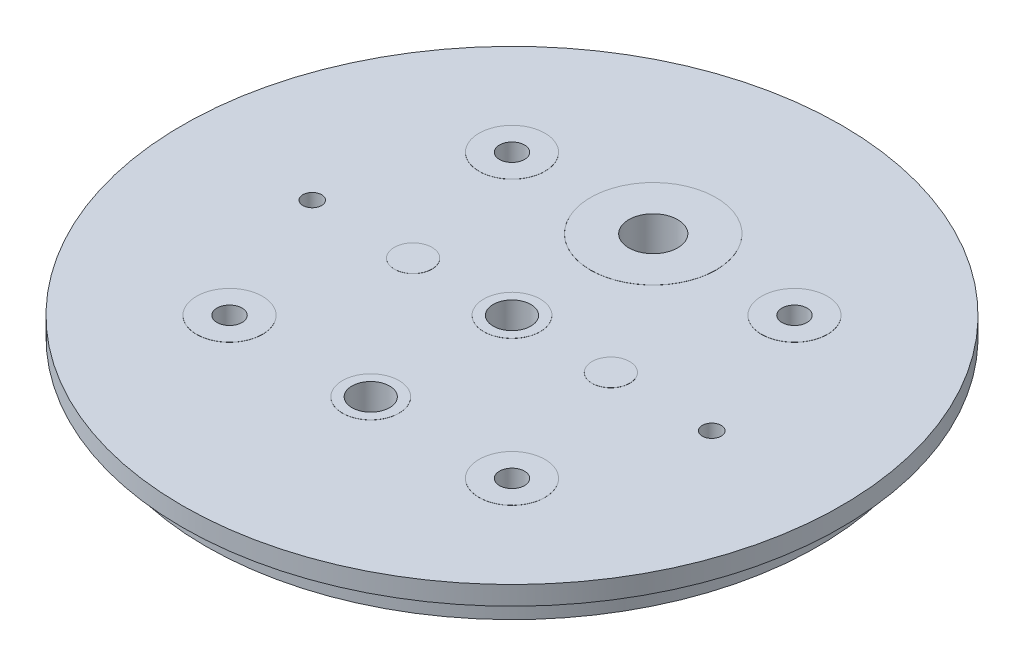
ISO-10303-21;
HEADER;
FILE_DESCRIPTION(('STEP AP214'),'2;1');
FILE_NAME('part.step','',(''),(''),'','','');
FILE_SCHEMA(('AUTOMOTIVE_DESIGN { 1 0 10303 214 1 1 1 1 }'));
ENDSEC;
DATA;
#1=APPLICATION_CONTEXT('core data for automotive mechanical design processes');
#2=APPLICATION_PROTOCOL_DEFINITION('international standard','automotive_design',2000,#1);
#3=PRODUCT_CONTEXT('',#1,'mechanical');
#4=PRODUCT('Part','Part','',(#3));
#5=PRODUCT_RELATED_PRODUCT_CATEGORY('part','',(#4));
#6=PRODUCT_DEFINITION_FORMATION('','',#4);
#7=PRODUCT_DEFINITION_CONTEXT('part definition',#1,'design');
#8=PRODUCT_DEFINITION('design','',#6,#7);
#9=PRODUCT_DEFINITION_SHAPE('','',#8);
#10=(LENGTH_UNIT() NAMED_UNIT(*) SI_UNIT(.MILLI.,.METRE.));
#11=(NAMED_UNIT(*) PLANE_ANGLE_UNIT() SI_UNIT($,.RADIAN.));
#12=(NAMED_UNIT(*) SI_UNIT($,.STERADIAN.) SOLID_ANGLE_UNIT());
#13=UNCERTAINTY_MEASURE_WITH_UNIT(LENGTH_MEASURE(1.E-05),#10,'distance_accuracy_value','');
#14=(GEOMETRIC_REPRESENTATION_CONTEXT(3) GLOBAL_UNCERTAINTY_ASSIGNED_CONTEXT((#13)) GLOBAL_UNIT_ASSIGNED_CONTEXT((#10,
#11,#12)) REPRESENTATION_CONTEXT('',''));
#15=CARTESIAN_POINT('',(0.,0.,0.));
#16=DIRECTION('',(0.,0.,1.));
#17=DIRECTION('',(1.,0.,0.));
#18=AXIS2_PLACEMENT_3D('',#15,#16,#17);
#19=CARTESIAN_POINT('',(22.4996823848627,36.2233266135934,22.3432986914773));
#20=DIRECTION('',(0.,-1.,0.));
#21=DIRECTION('',(0.,0.,-1.));
#22=AXIS2_PLACEMENT_3D('',#19,#20,#21);
#23=CYLINDRICAL_SURFACE('',#22,2.);
#24=CARTESIAN_POINT('',(22.4996823848627,26.2423537848137,22.3432986914773));
#25=DIRECTION('',(0.,-1.,0.));
#26=DIRECTION('',(1.,0.,0.));
#27=AXIS2_PLACEMENT_3D('',#24,#25,#26);
#28=CIRCLE('',#27,2.);
#29=CARTESIAN_POINT('',(24.4996823848627,26.2423537848137,22.3432986914773));
#30=VERTEX_POINT('',#29);
#31=EDGE_CURVE('E138',#30,#30,#28,.F.);
#32=ORIENTED_EDGE('',*,*,#31,.T.);
#33=EDGE_LOOP('',(#32));
#34=FACE_BOUND('',#33,.T.);
#35=CARTESIAN_POINT('',(22.4996823848627,20.7233240058903,22.3432986914773));
#36=DIRECTION('',(0.,-1.,0.));
#37=DIRECTION('',(1.,0.,0.));
#38=AXIS2_PLACEMENT_3D('',#35,#36,#37);
#39=CIRCLE('',#38,2.);
#40=CARTESIAN_POINT('',(24.4996823848627,20.7233240058903,22.3432986914773));
#41=VERTEX_POINT('',#40);
#42=EDGE_CURVE('E49',#41,#41,#39,.T.);
#43=ORIENTED_EDGE('',*,*,#42,.T.);
#44=EDGE_LOOP('',(#43));
#45=FACE_BOUND('',#44,.T.);
#46=ADVANCED_FACE('F45',(#34,#45),#23,.F.);
#47=CARTESIAN_POINT('',(-22.5003182856895,36.2233266135934,22.3432986914773));
#48=DIRECTION('',(0.,-1.,0.));
#49=DIRECTION('',(0.,0.,-1.));
#50=AXIS2_PLACEMENT_3D('',#47,#48,#49);
#51=CYLINDRICAL_SURFACE('',#50,2.);
#52=CARTESIAN_POINT('',(-22.5003182856895,26.2423537848136,22.3432986914773));
#53=DIRECTION('',(0.,-1.,0.));
#54=DIRECTION('',(1.,0.,0.));
#55=AXIS2_PLACEMENT_3D('',#52,#53,#54);
#56=CIRCLE('',#55,2.);
#57=CARTESIAN_POINT('',(-20.5003182856895,26.2423537848136,22.3432986914773));
#58=VERTEX_POINT('',#57);
#59=EDGE_CURVE('E145',#58,#58,#56,.F.);
#60=ORIENTED_EDGE('',*,*,#59,.T.);
#61=EDGE_LOOP('',(#60));
#62=FACE_BOUND('',#61,.T.);
#63=CARTESIAN_POINT('',(-22.5003182856895,20.7233240058903,22.3432986914773));
#64=DIRECTION('',(0.,-1.,0.));
#65=DIRECTION('',(1.,0.,0.));
#66=AXIS2_PLACEMENT_3D('',#63,#64,#65);
#67=CIRCLE('',#66,2.);
#68=CARTESIAN_POINT('',(-20.5003182856895,20.7233240058903,22.3432986914773));
#69=VERTEX_POINT('',#68);
#70=EDGE_CURVE('E168',#69,#69,#67,.T.);
#71=ORIENTED_EDGE('',*,*,#70,.T.);
#72=EDGE_LOOP('',(#71));
#73=FACE_BOUND('',#72,.T.);
#74=ADVANCED_FACE('F280',(#62,#73),#51,.F.);
#75=CARTESIAN_POINT('',(-22.5003182856895,36.2233266135934,-22.6567019790749));
#76=DIRECTION('',(0.,-1.,0.));
#77=DIRECTION('',(0.,0.,-1.));
#78=AXIS2_PLACEMENT_3D('',#75,#76,#77);
#79=CYLINDRICAL_SURFACE('',#78,2.);
#80=CARTESIAN_POINT('',(-22.5003182856895,26.2423537848136,-22.6567019790749));
#81=DIRECTION('',(0.,-1.,0.));
#82=DIRECTION('',(1.,0.,0.));
#83=AXIS2_PLACEMENT_3D('',#80,#81,#82);
#84=CIRCLE('',#83,2.);
#85=CARTESIAN_POINT('',(-20.5003182856895,26.2423537848136,-22.6567019790749));
#86=VERTEX_POINT('',#85);
#87=EDGE_CURVE('E148',#86,#86,#84,.F.);
#88=ORIENTED_EDGE('',*,*,#87,.T.);
#89=EDGE_LOOP('',(#88));
#90=FACE_BOUND('',#89,.T.);
#91=CARTESIAN_POINT('',(-22.5003182856895,20.7233240058903,-22.6567019790749));
#92=DIRECTION('',(0.,-1.,0.));
#93=DIRECTION('',(1.,0.,0.));
#94=AXIS2_PLACEMENT_3D('',#91,#92,#93);
#95=CIRCLE('',#94,2.);
#96=CARTESIAN_POINT('',(-20.5003182856895,20.7233240058903,-22.6567019790749));
#97=VERTEX_POINT('',#96);
#98=EDGE_CURVE('E165',#97,#97,#95,.T.);
#99=ORIENTED_EDGE('',*,*,#98,.T.);
#100=EDGE_LOOP('',(#99));
#101=FACE_BOUND('',#100,.T.);
#102=ADVANCED_FACE('F287',(#90,#101),#79,.F.);
#103=CARTESIAN_POINT('',(22.4996823848627,36.2233266135934,-22.6567019790749));
#104=DIRECTION('',(0.,-1.,0.));
#105=DIRECTION('',(0.,0.,-1.));
#106=AXIS2_PLACEMENT_3D('',#103,#104,#105);
#107=CYLINDRICAL_SURFACE('',#106,2.);
#108=CARTESIAN_POINT('',(22.4996823848627,26.2423537848137,-22.6567019790749));
#109=DIRECTION('',(0.,-1.,0.));
#110=DIRECTION('',(1.,0.,0.));
#111=AXIS2_PLACEMENT_3D('',#108,#109,#110);
#112=CIRCLE('',#111,2.);
#113=CARTESIAN_POINT('',(24.4996823848627,26.2423537848137,-22.6567019790749));
#114=VERTEX_POINT('',#113);
#115=EDGE_CURVE('E151',#114,#114,#112,.F.);
#116=ORIENTED_EDGE('',*,*,#115,.T.);
#117=EDGE_LOOP('',(#116));
#118=FACE_BOUND('',#117,.T.);
#119=CARTESIAN_POINT('',(22.4996823848627,20.7233240058903,-22.6567019790749));
#120=DIRECTION('',(0.,-1.,0.));
#121=DIRECTION('',(1.,0.,0.));
#122=AXIS2_PLACEMENT_3D('',#119,#120,#121);
#123=CIRCLE('',#122,2.);
#124=CARTESIAN_POINT('',(24.4996823848627,20.7233240058903,-22.6567019790749));
#125=VERTEX_POINT('',#124);
#126=EDGE_CURVE('E162',#125,#125,#123,.T.);
#127=ORIENTED_EDGE('',*,*,#126,.T.);
#128=EDGE_LOOP('',(#127));
#129=FACE_BOUND('',#128,.T.);
#130=ADVANCED_FACE('F458',(#118,#129),#107,.F.);
#131=CARTESIAN_POINT('',(-0.000317950413387203,26.2233266135934,52.3432991385121));
#132=DIRECTION('',(0.,1.,0.));
#133=DIRECTION('',(1.,0.,0.));
#134=AXIS2_PLACEMENT_3D('',#131,#132,#133);
#135=PLANE('',#134);
#136=CARTESIAN_POINT('',(-31.82012357796,26.2233266135934,-0.15670164379878));
#137=DIRECTION('',(0.,1.,0.));
#138=DIRECTION('',(0.,0.,1.));
#139=AXIS2_PLACEMENT_3D('',#136,#137,#138);
#140=CIRCLE('',#139,1.5);
#141=CARTESIAN_POINT('',(-31.82012357796,26.2233266135934,1.34329835620122));
#142=VERTEX_POINT('',#141);
#143=EDGE_CURVE('E161',#142,#142,#140,.F.);
#144=ORIENTED_EDGE('',*,*,#143,.T.);
#145=EDGE_LOOP('',(#144));
#146=FACE_BOUND('',#145,.T.);
#147=CARTESIAN_POINT('',(31.8194876771333,26.2233266135934,-0.15670164379878));
#148=DIRECTION('',(0.,1.,0.));
#149=DIRECTION('',(0.,0.,1.));
#150=AXIS2_PLACEMENT_3D('',#147,#148,#149);
#151=CIRCLE('',#150,1.5);
#152=CARTESIAN_POINT('',(31.8194876771333,26.2233266135934,1.34329835620122));
#153=VERTEX_POINT('',#152);
#154=EDGE_CURVE('E157',#153,#153,#151,.F.);
#155=ORIENTED_EDGE('',*,*,#154,.T.);
#156=EDGE_LOOP('',(#155));
#157=FACE_BOUND('',#156,.T.);
#158=CARTESIAN_POINT('',(-0.00031795041337055,26.2233266135934,-22.6567016437988));
#159=DIRECTION('',(0.,1.,0.));
#160=DIRECTION('',(0.,0.,1.));
#161=AXIS2_PLACEMENT_3D('',#158,#159,#160);
#162=CIRCLE('',#161,10.);
#163=CARTESIAN_POINT('',(-0.00031795041337055,26.2233266135934,-12.6567016437988));
#164=VERTEX_POINT('',#163);
#165=EDGE_CURVE('E11',#164,#164,#162,.T.);
#166=ORIENTED_EDGE('',*,*,#165,.F.);
#167=EDGE_LOOP('',(#166));
#168=FACE_BOUND('',#167,.T.);
#169=CARTESIAN_POINT('',(22.4996823848627,26.2233266135934,22.3432986914773));
#170=DIRECTION('',(0.,1.,0.));
#171=DIRECTION('',(0.,0.,1.));
#172=AXIS2_PLACEMENT_3D('',#169,#170,#171);
#173=CIRCLE('',#172,5.25);
#174=CARTESIAN_POINT('',(22.4996823848627,26.2233266135934,27.5932986914773));
#175=VERTEX_POINT('',#174);
#176=EDGE_CURVE('E55',#175,#175,#173,.T.);
#177=ORIENTED_EDGE('',*,*,#176,.F.);
#178=EDGE_LOOP('',(#177));
#179=FACE_BOUND('',#178,.T.);
#180=CARTESIAN_POINT('',(-22.5003182856895,26.2233266135934,22.3432986914773));
#181=DIRECTION('',(0.,1.,0.));
#182=DIRECTION('',(0.,0.,1.));
#183=AXIS2_PLACEMENT_3D('',#180,#181,#182);
#184=CIRCLE('',#183,5.25);
#185=CARTESIAN_POINT('',(-22.5003182856895,26.2233266135934,27.5932986914773));
#186=VERTEX_POINT('',#185);
#187=EDGE_CURVE('E224',#186,#186,#184,.T.);
#188=ORIENTED_EDGE('',*,*,#187,.F.);
#189=EDGE_LOOP('',(#188));
#190=FACE_BOUND('',#189,.T.);
#191=CARTESIAN_POINT('',(-22.5003182856895,26.2233266135934,-22.6567019790749));
#192=DIRECTION('',(0.,1.,0.));
#193=DIRECTION('',(0.,0.,1.));
#194=AXIS2_PLACEMENT_3D('',#191,#192,#193);
#195=CIRCLE('',#194,5.25);
#196=CARTESIAN_POINT('',(-22.5003182856895,26.2233266135934,-17.4067019790749));
#197=VERTEX_POINT('',#196);
#198=EDGE_CURVE('E108',#197,#197,#195,.T.);
#199=ORIENTED_EDGE('',*,*,#198,.F.);
#200=EDGE_LOOP('',(#199));
#201=FACE_BOUND('',#200,.T.);
#202=CARTESIAN_POINT('',(22.4996823848627,26.2233266135934,-22.6567019790749));
#203=DIRECTION('',(0.,1.,0.));
#204=DIRECTION('',(0.,0.,1.));
#205=AXIS2_PLACEMENT_3D('',#202,#203,#204);
#206=CIRCLE('',#205,5.25);
#207=CARTESIAN_POINT('',(22.4996823848627,26.2233266135934,-17.4067019790749));
#208=VERTEX_POINT('',#207);
#209=EDGE_CURVE('E100',#208,#208,#206,.T.);
#210=ORIENTED_EDGE('',*,*,#209,.F.);
#211=EDGE_LOOP('',(#210));
#212=FACE_BOUND('',#211,.T.);
#213=CARTESIAN_POINT('',(-0.000317950413375546,26.2233266135934,-0.15670164379878));
#214=DIRECTION('',(0.,-1.,0.));
#215=DIRECTION('',(0.,0.,1.));
#216=AXIS2_PLACEMENT_3D('',#213,#214,#215);
#217=CIRCLE('',#216,52.5000007823109);
#218=CARTESIAN_POINT('',(-0.000317950413357459,26.2233266135934,-52.6567014901305));
#219=VERTEX_POINT('',#218);
#220=EDGE_CURVE('E66',#219,#219,#217,.T.);
#221=ORIENTED_EDGE('',*,*,#220,.F.);
#222=EDGE_LOOP('',(#221));
#223=FACE_BOUND('',#222,.T.);
#224=CARTESIAN_POINT('',(-0.000317950413375546,26.2233266135934,-0.15670164379878));
#225=DIRECTION('',(0.,1.,0.));
#226=DIRECTION('',(0.,0.,1.));
#227=AXIS2_PLACEMENT_3D('',#224,#225,#226);
#228=CIRCLE('',#227,4.5);
#229=CARTESIAN_POINT('',(-0.000317950413375546,26.2233266135934,4.34329835620122));
#230=VERTEX_POINT('',#229);
#231=EDGE_CURVE('E200',#230,#230,#228,.T.);
#232=ORIENTED_EDGE('',*,*,#231,.F.);
#233=EDGE_LOOP('',(#232));
#234=FACE_BOUND('',#233,.T.);
#235=CARTESIAN_POINT('',(-0.000317950413380542,26.2233266135934,22.3432986914773));
#236=DIRECTION('',(0.,1.,0.));
#237=DIRECTION('',(0.,0.,1.));
#238=AXIS2_PLACEMENT_3D('',#235,#236,#237);
#239=CIRCLE('',#238,4.5);
#240=CARTESIAN_POINT('',(-0.000317950413380542,26.2233266135934,26.8432986914773));
#241=VERTEX_POINT('',#240);
#242=EDGE_CURVE('E227',#241,#241,#239,.T.);
#243=ORIENTED_EDGE('',*,*,#242,.F.);
#244=EDGE_LOOP('',(#243));
#245=FACE_BOUND('',#244,.T.);
#246=CARTESIAN_POINT('',(-15.7503181851067,26.2233266135934,-0.15670164379878));
#247=DIRECTION('',(0.,1.,0.));
#248=DIRECTION('',(0.,0.,1.));
#249=AXIS2_PLACEMENT_3D('',#246,#247,#248);
#250=CIRCLE('',#249,3.00000004470348);
#251=CARTESIAN_POINT('',(-15.7503181851067,26.2233266135934,2.8432984009047));
#252=VERTEX_POINT('',#251);
#253=EDGE_CURVE('E214',#252,#252,#250,.T.);
#254=ORIENTED_EDGE('',*,*,#253,.F.);
#255=EDGE_LOOP('',(#254));
#256=FACE_BOUND('',#255,.T.);
#257=CARTESIAN_POINT('',(15.7496822842799,26.2233266135934,-0.15670164379878));
#258=DIRECTION('',(0.,1.,0.));
#259=DIRECTION('',(0.,0.,1.));
#260=AXIS2_PLACEMENT_3D('',#257,#258,#259);
#261=CIRCLE('',#260,3.00000004470345);
#262=CARTESIAN_POINT('',(15.7496822842799,26.2233266135934,2.84329840090467));
#263=VERTEX_POINT('',#262);
#264=EDGE_CURVE('E207',#263,#263,#261,.T.);
#265=ORIENTED_EDGE('',*,*,#264,.F.);
#266=EDGE_LOOP('',(#265));
#267=FACE_BOUND('',#266,.T.);
#268=ADVANCED_FACE('F453',(#146,#157,#168,#179,#190,#201,#212,#223,#234,#245,#256,#267),#135,.T.);
#269=CARTESIAN_POINT('',(-0.000317950413375809,23.2233253004286,7.34329874735694));
#270=DIRECTION('',(0.,-1.,0.));
#271=DIRECTION('',(0.,0.,-1.));
#272=AXIS2_PLACEMENT_3D('',#269,#270,#271);
#273=PLANE('',#272);
#274=CARTESIAN_POINT('',(-0.000317950413374144,23.2233253004286,-0.15670164379878));
#275=DIRECTION('',(0.,1.,0.));
#276=DIRECTION('',(0.,0.,1.));
#277=AXIS2_PLACEMENT_3D('',#274,#275,#276);
#278=CIRCLE('',#277,10.5000001564622);
#279=CARTESIAN_POINT('',(-0.000317950413370526,23.2233253004286,-10.656701800261));
#280=VERTEX_POINT('',#279);
#281=EDGE_CURVE('E121',#280,#280,#278,.T.);
#282=ORIENTED_EDGE('',*,*,#281,.F.);
#283=EDGE_LOOP('',(#282));
#284=FACE_BOUND('',#283,.T.);
#285=CARTESIAN_POINT('',(-0.000317950413374144,23.2233253004286,-0.15670164379878));
#286=DIRECTION('',(0.,-1.,0.));
#287=DIRECTION('',(0.,0.,1.));
#288=AXIS2_PLACEMENT_3D('',#285,#286,#287);
#289=CIRCLE('',#288,7.50000039115572);
#290=CARTESIAN_POINT('',(-0.00031795041337156,23.2233253004286,-7.65670203495432));
#291=VERTEX_POINT('',#290);
#292=EDGE_CURVE('E114',#291,#291,#289,.T.);
#293=ORIENTED_EDGE('',*,*,#292,.F.);
#294=EDGE_LOOP('',(#293));
#295=FACE_BOUND('',#294,.T.);
#296=ADVANCED_FACE('F457',(#284,#295),#273,.T.);
#297=CARTESIAN_POINT('',(-0.000317950413369533,11.223326390076,4.34329842325644));
#298=DIRECTION('',(0.,-1.,0.));
#299=DIRECTION('',(0.,0.,-1.));
#300=AXIS2_PLACEMENT_3D('',#297,#298,#299);
#301=PLANE('',#300);
#302=CARTESIAN_POINT('',(-0.000317950413375546,11.223326390076,-0.15670164379878));
#303=DIRECTION('',(0.,1.,0.));
#304=DIRECTION('',(0.,0.,1.));
#305=AXIS2_PLACEMENT_3D('',#302,#303,#304);
#306=CIRCLE('',#305,3.);
#307=CARTESIAN_POINT('',(-0.000317950413375546,11.223326390076,2.84329835620122));
#308=VERTEX_POINT('',#307);
#309=EDGE_CURVE('E137',#308,#308,#306,.T.);
#310=ORIENTED_EDGE('',*,*,#309,.T.);
#311=EDGE_LOOP('',(#310));
#312=FACE_BOUND('',#311,.T.);
#313=CARTESIAN_POINT('',(-0.000317950413368534,11.223326390076,-0.15670164379878));
#314=DIRECTION('',(0.,-1.,0.));
#315=DIRECTION('',(0.,0.,1.));
#316=AXIS2_PLACEMENT_3D('',#313,#314,#315);
#317=CIRCLE('',#316,7.50000039115552);
#318=CARTESIAN_POINT('',(-0.00031795041336595,11.223326390076,-7.65670203495432));
#319=VERTEX_POINT('',#318);
#320=EDGE_CURVE('E94',#319,#319,#317,.T.);
#321=ORIENTED_EDGE('',*,*,#320,.T.);
#322=EDGE_LOOP('',(#321));
#323=FACE_BOUND('',#322,.T.);
#324=ADVANCED_FACE('F536',(#312,#323),#301,.T.);
#325=CARTESIAN_POINT('',(-0.000317950413374845,24.723325948629,-0.15670164379878));
#326=DIRECTION('',(0.,-1.,0.));
#327=DIRECTION('',(0.,0.,1.));
#328=AXIS2_PLACEMENT_3D('',#325,#326,#327);
#329=CYLINDRICAL_SURFACE('',#328,52.4999998463317);
#330=CARTESIAN_POINT('',(-0.000317950413374144,23.2233252836647,-0.15670164379878));
#331=DIRECTION('',(0.,-1.,0.));
#332=DIRECTION('',(0.,0.,1.));
#333=AXIS2_PLACEMENT_3D('',#330,#331,#332);
#334=CIRCLE('',#333,52.4999989103526);
#335=CARTESIAN_POINT('',(-0.000317950413356057,23.2233252836647,-52.6567014901305));
#336=VERTEX_POINT('',#335);
#337=EDGE_CURVE('E124',#336,#336,#334,.T.);
#338=ORIENTED_EDGE('',*,*,#337,.F.);
#339=DIRECTION('',(0.,1.,0.));
#340=VECTOR('',#339,1.);
#341=CARTESIAN_POINT('',(-0.000317950413356758,24.723325948629,-52.6567014901305));
#342=LINE('',#341,#340);
#343=EDGE_CURVE('E101',#336,#219,#342,.T.);
#344=ORIENTED_EDGE('',*,*,#343,.T.);
#345=ORIENTED_EDGE('',*,*,#220,.T.);
#346=ORIENTED_EDGE('',*,*,#343,.F.);
#347=EDGE_LOOP('',(#338,#344,#345,#346));
#348=FACE_BOUND('',#347,.T.);
#349=ADVANCED_FACE('F365',(#348),#329,.T.);
#350=CARTESIAN_POINT('',(-0.000317950413384968,23.2233252836647,48.5932972665538));
#351=DIRECTION('',(0.,-1.,0.));
#352=DIRECTION('',(0.,0.,-1.));
#353=AXIS2_PLACEMENT_3D('',#350,#351,#352);
#354=PLANE('',#353);
#355=ORIENTED_EDGE('',*,*,#337,.T.);
#356=EDGE_LOOP('',(#355));
#357=FACE_BOUND('',#356,.T.);
#358=CARTESIAN_POINT('',(-0.000317950413374144,23.2233252836647,-0.15670164379878));
#359=DIRECTION('',(0.,-1.,0.));
#360=DIRECTION('',(0.,0.,1.));
#361=AXIS2_PLACEMENT_3D('',#358,#359,#360);
#362=CIRCLE('',#361,48.7499989103526);
#363=CARTESIAN_POINT('',(-0.000317950413357349,23.2233252836647,-48.9067005541514));
#364=VERTEX_POINT('',#363);
#365=EDGE_CURVE('E132',#364,#364,#362,.T.);
#366=ORIENTED_EDGE('',*,*,#365,.F.);
#367=EDGE_LOOP('',(#366));
#368=FACE_BOUND('',#367,.T.);
#369=ADVANCED_FACE('F273',(#357,#368),#354,.T.);
#370=CARTESIAN_POINT('',(-0.000317950413373092,20.9733246447775,-0.15670164379878));
#371=DIRECTION('',(0.,-1.,0.));
#372=DIRECTION('',(0.,0.,1.));
#373=AXIS2_PLACEMENT_3D('',#370,#371,#372);
#374=CYLINDRICAL_SURFACE('',#373,48.7499989103526);
#375=CARTESIAN_POINT('',(-0.00031795041337204,18.7233240058902,-0.15670164379878));
#376=DIRECTION('',(0.,-1.,0.));
#377=DIRECTION('',(0.,0.,1.));
#378=AXIS2_PLACEMENT_3D('',#375,#376,#377);
#379=CIRCLE('',#378,48.7499989103526);
#380=CARTESIAN_POINT('',(-0.000317950413355245,18.7233240058902,-48.9067005541514));
#381=VERTEX_POINT('',#380);
#382=EDGE_CURVE('E128',#381,#381,#379,.T.);
#383=ORIENTED_EDGE('',*,*,#382,.F.);
#384=DIRECTION('',(0.,1.,0.));
#385=VECTOR('',#384,1.);
#386=CARTESIAN_POINT('',(-0.000317950413356297,20.9733246447775,-48.9067005541514));
#387=LINE('',#386,#385);
#388=EDGE_CURVE('E249',#381,#364,#387,.T.);
#389=ORIENTED_EDGE('',*,*,#388,.T.);
#390=ORIENTED_EDGE('',*,*,#365,.T.);
#391=ORIENTED_EDGE('',*,*,#388,.F.);
#392=EDGE_LOOP('',(#383,#389,#390,#391));
#393=FACE_BOUND('',#392,.T.);
#394=ADVANCED_FACE('F264',(#393),#374,.T.);
#395=CARTESIAN_POINT('',(-0.000317950413374372,18.7233240058903,10.3432985126634));
#396=DIRECTION('',(0.,-1.,0.));
#397=DIRECTION('',(0.,0.,-1.));
#398=AXIS2_PLACEMENT_3D('',#395,#396,#397);
#399=PLANE('',#398);
#400=CARTESIAN_POINT('',(22.4996823848627,18.7233240058903,22.3432986914773));
#401=DIRECTION('',(0.,-1.,0.));
#402=DIRECTION('',(1.,0.,0.));
#403=AXIS2_PLACEMENT_3D('',#400,#401,#402);
#404=CIRCLE('',#403,3.5);
#405=CARTESIAN_POINT('',(25.9996823848627,18.7233240058903,22.3432986914773));
#406=VERTEX_POINT('',#405);
#407=EDGE_CURVE('E672',#406,#406,#404,.T.);
#408=ORIENTED_EDGE('',*,*,#407,.F.);
#409=EDGE_LOOP('',(#408));
#410=FACE_BOUND('',#409,.T.);
#411=CARTESIAN_POINT('',(-22.5003182856895,18.7233240058903,22.3432986914773));
#412=DIRECTION('',(0.,-1.,0.));
#413=DIRECTION('',(1.,0.,0.));
#414=AXIS2_PLACEMENT_3D('',#411,#412,#413);
#415=CIRCLE('',#414,3.5);
#416=CARTESIAN_POINT('',(-19.0003182856895,18.7233240058903,22.3432986914773));
#417=VERTEX_POINT('',#416);
#418=EDGE_CURVE('E671',#417,#417,#415,.T.);
#419=ORIENTED_EDGE('',*,*,#418,.F.);
#420=EDGE_LOOP('',(#419));
#421=FACE_BOUND('',#420,.T.);
#422=CARTESIAN_POINT('',(-22.5003182856895,18.7233240058903,-22.6567019790749));
#423=DIRECTION('',(0.,-1.,0.));
#424=DIRECTION('',(1.,0.,0.));
#425=AXIS2_PLACEMENT_3D('',#422,#423,#424);
#426=CIRCLE('',#425,3.5);
#427=CARTESIAN_POINT('',(-19.0003182856895,18.7233240058903,-22.6567019790749));
#428=VERTEX_POINT('',#427);
#429=EDGE_CURVE('E688',#428,#428,#426,.T.);
#430=ORIENTED_EDGE('',*,*,#429,.F.);
#431=EDGE_LOOP('',(#430));
#432=FACE_BOUND('',#431,.T.);
#433=CARTESIAN_POINT('',(22.4996823848627,18.7233240058903,-22.6567019790749));
#434=DIRECTION('',(0.,-1.,0.));
#435=DIRECTION('',(1.,0.,0.));
#436=AXIS2_PLACEMENT_3D('',#433,#434,#435);
#437=CIRCLE('',#436,3.5);
#438=CARTESIAN_POINT('',(25.9996823848627,18.7233240058903,-22.6567019790749));
#439=VERTEX_POINT('',#438);
#440=EDGE_CURVE('E183',#439,#439,#437,.T.);
#441=ORIENTED_EDGE('',*,*,#440,.F.);
#442=EDGE_LOOP('',(#441));
#443=FACE_BOUND('',#442,.T.);
#444=CARTESIAN_POINT('',(-31.82012357796,18.7233240058903,-0.15670164379878));
#445=DIRECTION('',(0.,-1.,0.));
#446=DIRECTION('',(1.,0.,0.));
#447=AXIS2_PLACEMENT_3D('',#444,#445,#446);
#448=CIRCLE('',#447,1.5);
#449=CARTESIAN_POINT('',(-30.32012357796,18.7233240058903,-0.15670164379878));
#450=VERTEX_POINT('',#449);
#451=EDGE_CURVE('E158',#450,#450,#448,.F.);
#452=ORIENTED_EDGE('',*,*,#451,.T.);
#453=EDGE_LOOP('',(#452));
#454=FACE_BOUND('',#453,.T.);
#455=CARTESIAN_POINT('',(31.8194876771333,18.7233240058903,-0.15670164379878));
#456=DIRECTION('',(0.,-1.,0.));
#457=DIRECTION('',(1.,0.,0.));
#458=AXIS2_PLACEMENT_3D('',#455,#456,#457);
#459=CIRCLE('',#458,1.5);
#460=CARTESIAN_POINT('',(33.3194876771333,18.7233240058903,-0.15670164379878));
#461=VERTEX_POINT('',#460);
#462=EDGE_CURVE('E154',#461,#461,#459,.F.);
#463=ORIENTED_EDGE('',*,*,#462,.T.);
#464=EDGE_LOOP('',(#463));
#465=FACE_BOUND('',#464,.T.);
#466=CARTESIAN_POINT('',(-0.000317950413380542,18.7233240058903,22.3432986914773));
#467=DIRECTION('',(0.,-1.,0.));
#468=DIRECTION('',(1.,0.,0.));
#469=AXIS2_PLACEMENT_3D('',#466,#467,#468);
#470=CIRCLE('',#469,3.);
#471=CARTESIAN_POINT('',(2.99968204958662,18.7233240058903,22.3432986914773));
#472=VERTEX_POINT('',#471);
#473=EDGE_CURVE('E144',#472,#472,#470,.F.);
#474=ORIENTED_EDGE('',*,*,#473,.T.);
#475=EDGE_LOOP('',(#474));
#476=FACE_BOUND('',#475,.T.);
#477=CARTESIAN_POINT('',(-0.00031795041337055,18.7233240058903,-22.6567016437988));
#478=DIRECTION('',(0.,-1.,0.));
#479=DIRECTION('',(1.,0.,0.));
#480=AXIS2_PLACEMENT_3D('',#477,#478,#479);
#481=CIRCLE('',#480,3.9);
#482=CARTESIAN_POINT('',(3.89968204958663,18.7233240058903,-22.6567016437988));
#483=VERTEX_POINT('',#482);
#484=EDGE_CURVE('E136',#483,#483,#481,.F.);
#485=ORIENTED_EDGE('',*,*,#484,.T.);
#486=EDGE_LOOP('',(#485));
#487=FACE_BOUND('',#486,.T.);
#488=ORIENTED_EDGE('',*,*,#382,.T.);
#489=EDGE_LOOP('',(#488));
#490=FACE_BOUND('',#489,.T.);
#491=CARTESIAN_POINT('',(-0.00031795041337204,18.7233240058903,-0.15670164379878));
#492=DIRECTION('',(0.,-1.,0.));
#493=DIRECTION('',(0.,0.,1.));
#494=AXIS2_PLACEMENT_3D('',#491,#492,#493);
#495=CIRCLE('',#494,10.5000001564622);
#496=CARTESIAN_POINT('',(-0.000317950413368423,18.7233240058903,-10.656701800261));
#497=VERTEX_POINT('',#496);
#498=EDGE_CURVE('E120',#497,#497,#495,.T.);
#499=ORIENTED_EDGE('',*,*,#498,.F.);
#500=EDGE_LOOP('',(#499));
#501=FACE_BOUND('',#500,.T.);
#502=ADVANCED_FACE('F262',(#410,#421,#432,#443,#454,#465,#476,#487,#490,#501),#399,.T.);
#503=CARTESIAN_POINT('',(-0.000317950413372917,20.5983246531594,-0.15670164379878));
#504=DIRECTION('',(0.,-1.,0.));
#505=DIRECTION('',(0.,0.,1.));
#506=AXIS2_PLACEMENT_3D('',#503,#504,#505);
#507=CYLINDRICAL_SURFACE('',#506,10.5000001564622);
#508=ORIENTED_EDGE('',*,*,#498,.T.);
#509=DIRECTION('',(0.,1.,0.));
#510=VECTOR('',#509,1.);
#511=CARTESIAN_POINT('',(-0.000317950413369299,20.5983246531594,-10.656701800261));
#512=LINE('',#511,#510);
#513=EDGE_CURVE('E116',#497,#280,#512,.T.);
#514=ORIENTED_EDGE('',*,*,#513,.T.);
#515=ORIENTED_EDGE('',*,*,#281,.T.);
#516=ORIENTED_EDGE('',*,*,#513,.F.);
#517=EDGE_LOOP('',(#508,#514,#515,#516));
#518=FACE_BOUND('',#517,.T.);
#519=ADVANCED_FACE('F47',(#518),#507,.F.);
#520=CARTESIAN_POINT('',(-0.000317950413371164,16.8483258452523,-0.15670164379878));
#521=DIRECTION('',(0.,-1.,0.));
#522=DIRECTION('',(0.,0.,1.));
#523=AXIS2_PLACEMENT_3D('',#520,#521,#522);
#524=CYLINDRICAL_SURFACE('',#523,7.50000039115554);
#525=ORIENTED_EDGE('',*,*,#320,.F.);
#526=DIRECTION('',(0.,1.,0.));
#527=VECTOR('',#526,1.);
#528=CARTESIAN_POINT('',(-0.00031795041336858,16.8483258452523,-7.65670203495432));
#529=LINE('',#528,#527);
#530=EDGE_CURVE('E97',#319,#291,#529,.T.);
#531=ORIENTED_EDGE('',*,*,#530,.T.);
#532=ORIENTED_EDGE('',*,*,#292,.T.);
#533=ORIENTED_EDGE('',*,*,#530,.F.);
#534=EDGE_LOOP('',(#525,#531,#532,#533));
#535=FACE_BOUND('',#534,.T.);
#536=ADVANCED_FACE('F95',(#535),#524,.T.);
#537=CARTESIAN_POINT('',(22.4996823848627,26.2423537848137,-22.6567019790749));
#538=DIRECTION('',(0.,-1.,0.));
#539=DIRECTION('',(1.,0.,0.));
#540=AXIS2_PLACEMENT_3D('',#537,#538,#539);
#541=CYLINDRICAL_SURFACE('',#540,5.25);
#542=ORIENTED_EDGE('',*,*,#209,.T.);
#543=EDGE_LOOP('',(#542));
#544=FACE_BOUND('',#543,.T.);
#545=CARTESIAN_POINT('',(22.4996823848627,26.2423537848137,-22.6567019790749));
#546=DIRECTION('',(0.,-1.,0.));
#547=DIRECTION('',(1.,0.,0.));
#548=AXIS2_PLACEMENT_3D('',#545,#546,#547);
#549=CIRCLE('',#548,5.25);
#550=CARTESIAN_POINT('',(27.7496823848627,26.2423537848137,-22.6567019790749));
#551=VERTEX_POINT('',#550);
#552=EDGE_CURVE('E239',#551,#551,#549,.T.);
#553=ORIENTED_EDGE('',*,*,#552,.T.);
#554=EDGE_LOOP('',(#553));
#555=FACE_BOUND('',#554,.T.);
#556=ADVANCED_FACE('F360',(#544,#555),#541,.T.);
#557=CARTESIAN_POINT('',(22.4996823848627,26.2423537848137,-22.6567019790749));
#558=DIRECTION('',(0.,-1.,0.));
#559=DIRECTION('',(1.,0.,0.));
#560=AXIS2_PLACEMENT_3D('',#557,#558,#559);
#561=PLANE('',#560);
#562=ORIENTED_EDGE('',*,*,#115,.F.);
#563=EDGE_LOOP('',(#562));
#564=FACE_BOUND('',#563,.T.);
#565=ORIENTED_EDGE('',*,*,#552,.F.);
#566=EDGE_LOOP('',(#565));
#567=FACE_BOUND('',#566,.T.);
#568=ADVANCED_FACE('F356',(#564,#567),#561,.F.);
#569=CARTESIAN_POINT('',(-22.5003182856895,26.2423537848136,-22.6567019790749));
#570=DIRECTION('',(0.,-1.,0.));
#571=DIRECTION('',(1.,0.,0.));
#572=AXIS2_PLACEMENT_3D('',#569,#570,#571);
#573=CYLINDRICAL_SURFACE('',#572,5.25);
#574=ORIENTED_EDGE('',*,*,#198,.T.);
#575=EDGE_LOOP('',(#574));
#576=FACE_BOUND('',#575,.T.);
#577=CARTESIAN_POINT('',(-22.5003182856895,26.2423537848136,-22.6567019790749));
#578=DIRECTION('',(0.,-1.,0.));
#579=DIRECTION('',(1.,0.,0.));
#580=AXIS2_PLACEMENT_3D('',#577,#578,#579);
#581=CIRCLE('',#580,5.25);
#582=CARTESIAN_POINT('',(-17.2503182856895,26.2423537848136,-22.6567019790749));
#583=VERTEX_POINT('',#582);
#584=EDGE_CURVE('E234',#583,#583,#581,.T.);
#585=ORIENTED_EDGE('',*,*,#584,.T.);
#586=EDGE_LOOP('',(#585));
#587=FACE_BOUND('',#586,.T.);
#588=ADVANCED_FACE('F352',(#576,#587),#573,.T.);
#589=CARTESIAN_POINT('',(-22.5003182856895,26.2423537848136,-22.6567019790749));
#590=DIRECTION('',(0.,-1.,0.));
#591=DIRECTION('',(1.,0.,0.));
#592=AXIS2_PLACEMENT_3D('',#589,#590,#591);
#593=PLANE('',#592);
#594=ORIENTED_EDGE('',*,*,#87,.F.);
#595=EDGE_LOOP('',(#594));
#596=FACE_BOUND('',#595,.T.);
#597=ORIENTED_EDGE('',*,*,#584,.F.);
#598=EDGE_LOOP('',(#597));
#599=FACE_BOUND('',#598,.T.);
#600=ADVANCED_FACE('F348',(#596,#599),#593,.F.);
#601=CARTESIAN_POINT('',(-22.5003182856895,26.2423537848136,22.3432986914773));
#602=DIRECTION('',(0.,-1.,0.));
#603=DIRECTION('',(1.,0.,0.));
#604=AXIS2_PLACEMENT_3D('',#601,#602,#603);
#605=CYLINDRICAL_SURFACE('',#604,5.25);
#606=ORIENTED_EDGE('',*,*,#187,.T.);
#607=EDGE_LOOP('',(#606));
#608=FACE_BOUND('',#607,.T.);
#609=CARTESIAN_POINT('',(-22.5003182856895,26.2423537848136,22.3432986914773));
#610=DIRECTION('',(0.,-1.,0.));
#611=DIRECTION('',(1.,0.,0.));
#612=AXIS2_PLACEMENT_3D('',#609,#610,#611);
#613=CIRCLE('',#612,5.25);
#614=CARTESIAN_POINT('',(-17.2503182856895,26.2423537848136,22.3432986914773));
#615=VERTEX_POINT('',#614);
#616=EDGE_CURVE('E231',#615,#615,#613,.T.);
#617=ORIENTED_EDGE('',*,*,#616,.T.);
#618=EDGE_LOOP('',(#617));
#619=FACE_BOUND('',#618,.T.);
#620=ADVANCED_FACE('F344',(#608,#619),#605,.T.);
#621=CARTESIAN_POINT('',(-22.5003182856895,26.2423537848136,22.3432986914773));
#622=DIRECTION('',(0.,-1.,0.));
#623=DIRECTION('',(1.,0.,0.));
#624=AXIS2_PLACEMENT_3D('',#621,#622,#623);
#625=PLANE('',#624);
#626=ORIENTED_EDGE('',*,*,#59,.F.);
#627=EDGE_LOOP('',(#626));
#628=FACE_BOUND('',#627,.T.);
#629=ORIENTED_EDGE('',*,*,#616,.F.);
#630=EDGE_LOOP('',(#629));
#631=FACE_BOUND('',#630,.T.);
#632=ADVANCED_FACE('F340',(#628,#631),#625,.F.);
#633=CARTESIAN_POINT('',(-0.000317950413380551,26.2423537848136,22.3432986914773));
#634=DIRECTION('',(0.,-1.,0.));
#635=DIRECTION('',(1.,0.,0.));
#636=AXIS2_PLACEMENT_3D('',#633,#634,#635);
#637=CYLINDRICAL_SURFACE('',#636,4.5);
#638=ORIENTED_EDGE('',*,*,#242,.T.);
#639=EDGE_LOOP('',(#638));
#640=FACE_BOUND('',#639,.T.);
#641=CARTESIAN_POINT('',(-0.000317950413380551,26.2423537848136,22.3432986914773));
#642=DIRECTION('',(0.,-1.,0.));
#643=DIRECTION('',(1.,0.,0.));
#644=AXIS2_PLACEMENT_3D('',#641,#642,#643);
#645=CIRCLE('',#644,4.5);
#646=CARTESIAN_POINT('',(4.49968204958662,26.2423537848136,22.3432986914773));
#647=VERTEX_POINT('',#646);
#648=EDGE_CURVE('E221',#647,#647,#645,.T.);
#649=ORIENTED_EDGE('',*,*,#648,.T.);
#650=EDGE_LOOP('',(#649));
#651=FACE_BOUND('',#650,.T.);
#652=ADVANCED_FACE('F336',(#640,#651),#637,.T.);
#653=CARTESIAN_POINT('',(-0.000317950413380551,26.2423537848136,22.3432986914773));
#654=DIRECTION('',(0.,-1.,0.));
#655=DIRECTION('',(1.,0.,0.));
#656=AXIS2_PLACEMENT_3D('',#653,#654,#655);
#657=PLANE('',#656);
#658=CARTESIAN_POINT('',(-0.000317950413380542,26.2423537848136,22.3432986914773));
#659=DIRECTION('',(0.,-1.,0.));
#660=DIRECTION('',(1.,0.,0.));
#661=AXIS2_PLACEMENT_3D('',#658,#659,#660);
#662=CIRCLE('',#661,3.);
#663=CARTESIAN_POINT('',(2.99968204958662,26.2423537848136,22.3432986914773));
#664=VERTEX_POINT('',#663);
#665=EDGE_CURVE('E141',#664,#664,#662,.F.);
#666=ORIENTED_EDGE('',*,*,#665,.F.);
#667=EDGE_LOOP('',(#666));
#668=FACE_BOUND('',#667,.T.);
#669=ORIENTED_EDGE('',*,*,#648,.F.);
#670=EDGE_LOOP('',(#669));
#671=FACE_BOUND('',#670,.T.);
#672=ADVANCED_FACE('F332',(#668,#671),#657,.F.);
#673=CARTESIAN_POINT('',(22.4996823848627,26.2423537848137,22.3432986914773));
#674=DIRECTION('',(0.,-1.,0.));
#675=DIRECTION('',(1.,0.,0.));
#676=AXIS2_PLACEMENT_3D('',#673,#674,#675);
#677=CYLINDRICAL_SURFACE('',#676,5.25);
#678=ORIENTED_EDGE('',*,*,#176,.T.);
#679=EDGE_LOOP('',(#678));
#680=FACE_BOUND('',#679,.T.);
#681=CARTESIAN_POINT('',(22.4996823848627,26.2423537848137,22.3432986914773));
#682=DIRECTION('',(0.,-1.,0.));
#683=DIRECTION('',(1.,0.,0.));
#684=AXIS2_PLACEMENT_3D('',#681,#682,#683);
#685=CIRCLE('',#684,5.25);
#686=CARTESIAN_POINT('',(27.7496823848627,26.2423537848137,22.3432986914773));
#687=VERTEX_POINT('',#686);
#688=EDGE_CURVE('E218',#687,#687,#685,.T.);
#689=ORIENTED_EDGE('',*,*,#688,.T.);
#690=EDGE_LOOP('',(#689));
#691=FACE_BOUND('',#690,.T.);
#692=ADVANCED_FACE('F328',(#680,#691),#677,.T.);
#693=CARTESIAN_POINT('',(22.4996823848627,26.2423537848137,22.3432986914773));
#694=DIRECTION('',(0.,-1.,0.));
#695=DIRECTION('',(1.,0.,0.));
#696=AXIS2_PLACEMENT_3D('',#693,#694,#695);
#697=PLANE('',#696);
#698=ORIENTED_EDGE('',*,*,#31,.F.);
#699=EDGE_LOOP('',(#698));
#700=FACE_BOUND('',#699,.T.);
#701=ORIENTED_EDGE('',*,*,#688,.F.);
#702=EDGE_LOOP('',(#701));
#703=FACE_BOUND('',#702,.T.);
#704=ADVANCED_FACE('F324',(#700,#703),#697,.F.);
#705=CARTESIAN_POINT('',(-15.7503181851067,26.2423537848136,-0.15670164379878));
#706=DIRECTION('',(0.,-1.,0.));
#707=DIRECTION('',(1.,0.,0.));
#708=AXIS2_PLACEMENT_3D('',#705,#706,#707);
#709=CYLINDRICAL_SURFACE('',#708,3.00000004470348);
#710=ORIENTED_EDGE('',*,*,#253,.T.);
#711=EDGE_LOOP('',(#710));
#712=FACE_BOUND('',#711,.T.);
#713=CARTESIAN_POINT('',(-15.7503181851067,26.2423537848136,-0.15670164379878));
#714=DIRECTION('',(0.,-1.,0.));
#715=DIRECTION('',(1.,0.,0.));
#716=AXIS2_PLACEMENT_3D('',#713,#714,#715);
#717=CIRCLE('',#716,3.00000004470348);
#718=CARTESIAN_POINT('',(-12.7503181404032,26.2423537848136,-0.15670164379878));
#719=VERTEX_POINT('',#718);
#720=EDGE_CURVE('E211',#719,#719,#717,.T.);
#721=ORIENTED_EDGE('',*,*,#720,.T.);
#722=EDGE_LOOP('',(#721));
#723=FACE_BOUND('',#722,.T.);
#724=ADVANCED_FACE('F320',(#712,#723),#709,.T.);
#725=CARTESIAN_POINT('',(-15.7503181851067,26.2423537848136,-0.15670164379878));
#726=DIRECTION('',(0.,-1.,0.));
#727=DIRECTION('',(1.,0.,0.));
#728=AXIS2_PLACEMENT_3D('',#725,#726,#727);
#729=PLANE('',#728);
#730=ORIENTED_EDGE('',*,*,#720,.F.);
#731=EDGE_LOOP('',(#730));
#732=FACE_BOUND('',#731,.T.);
#733=ADVANCED_FACE('F316',(#732),#729,.F.);
#734=CARTESIAN_POINT('',(15.7496822842799,26.2423537848136,-0.15670164379878));
#735=DIRECTION('',(0.,-1.,0.));
#736=DIRECTION('',(1.,0.,0.));
#737=AXIS2_PLACEMENT_3D('',#734,#735,#736);
#738=CYLINDRICAL_SURFACE('',#737,3.00000004470345);
#739=ORIENTED_EDGE('',*,*,#264,.T.);
#740=EDGE_LOOP('',(#739));
#741=FACE_BOUND('',#740,.T.);
#742=CARTESIAN_POINT('',(15.7496822842799,26.2423537848136,-0.15670164379878));
#743=DIRECTION('',(0.,-1.,0.));
#744=DIRECTION('',(1.,0.,0.));
#745=AXIS2_PLACEMENT_3D('',#742,#743,#744);
#746=CIRCLE('',#745,3.00000004470345);
#747=CARTESIAN_POINT('',(18.7496823289834,26.2423537848136,-0.15670164379878));
#748=VERTEX_POINT('',#747);
#749=EDGE_CURVE('E204',#748,#748,#746,.T.);
#750=ORIENTED_EDGE('',*,*,#749,.T.);
#751=EDGE_LOOP('',(#750));
#752=FACE_BOUND('',#751,.T.);
#753=ADVANCED_FACE('F312',(#741,#752),#738,.T.);
#754=CARTESIAN_POINT('',(15.7496822842799,26.2423537848136,-0.15670164379878));
#755=DIRECTION('',(0.,-1.,0.));
#756=DIRECTION('',(1.,0.,0.));
#757=AXIS2_PLACEMENT_3D('',#754,#755,#756);
#758=PLANE('',#757);
#759=ORIENTED_EDGE('',*,*,#749,.F.);
#760=EDGE_LOOP('',(#759));
#761=FACE_BOUND('',#760,.T.);
#762=ADVANCED_FACE('F308',(#761),#758,.F.);
#763=CARTESIAN_POINT('',(-0.000317950413375555,26.2423537848136,-0.15670164379878));
#764=DIRECTION('',(0.,-1.,0.));
#765=DIRECTION('',(1.,0.,0.));
#766=AXIS2_PLACEMENT_3D('',#763,#764,#765);
#767=CYLINDRICAL_SURFACE('',#766,4.5);
#768=ORIENTED_EDGE('',*,*,#231,.T.);
#769=EDGE_LOOP('',(#768));
#770=FACE_BOUND('',#769,.T.);
#771=CARTESIAN_POINT('',(-0.000317950413375555,26.2423537848136,-0.15670164379878));
#772=DIRECTION('',(0.,-1.,0.));
#773=DIRECTION('',(1.,0.,0.));
#774=AXIS2_PLACEMENT_3D('',#771,#772,#773);
#775=CIRCLE('',#774,4.5);
#776=CARTESIAN_POINT('',(4.49968204958662,26.2423537848136,-0.15670164379878));
#777=VERTEX_POINT('',#776);
#778=EDGE_CURVE('E196',#777,#777,#775,.T.);
#779=ORIENTED_EDGE('',*,*,#778,.T.);
#780=EDGE_LOOP('',(#779));
#781=FACE_BOUND('',#780,.T.);
#782=ADVANCED_FACE('F304',(#770,#781),#767,.T.);
#783=CARTESIAN_POINT('',(-0.000317950413375555,26.2423537848136,-0.15670164379878));
#784=DIRECTION('',(0.,-1.,0.));
#785=DIRECTION('',(1.,0.,0.));
#786=AXIS2_PLACEMENT_3D('',#783,#784,#785);
#787=PLANE('',#786);
#788=CARTESIAN_POINT('',(-0.000317950413375546,26.2423537848137,-0.15670164379878));
#789=DIRECTION('',(0.,1.,0.));
#790=DIRECTION('',(0.,0.,1.));
#791=AXIS2_PLACEMENT_3D('',#788,#789,#790);
#792=CIRCLE('',#791,3.);
#793=CARTESIAN_POINT('',(-0.000317950413375546,26.2423537848137,2.84329835620122));
#794=VERTEX_POINT('',#793);
#795=EDGE_CURVE('E173',#794,#794,#792,.T.);
#796=ORIENTED_EDGE('',*,*,#795,.F.);
#797=EDGE_LOOP('',(#796));
#798=FACE_BOUND('',#797,.T.);
#799=ORIENTED_EDGE('',*,*,#778,.F.);
#800=EDGE_LOOP('',(#799));
#801=FACE_BOUND('',#800,.T.);
#802=ADVANCED_FACE('F296',(#798,#801),#787,.F.);
#803=CARTESIAN_POINT('',(-0.000317950413370559,26.2423537848136,-22.6567016437988));
#804=DIRECTION('',(0.,-1.,0.));
#805=DIRECTION('',(1.,0.,0.));
#806=AXIS2_PLACEMENT_3D('',#803,#804,#805);
#807=PLANE('',#806);
#808=CARTESIAN_POINT('',(-0.00031795041337055,26.2423537848136,-22.6567016437988));
#809=DIRECTION('',(0.,-1.,0.));
#810=DIRECTION('',(1.,0.,0.));
#811=AXIS2_PLACEMENT_3D('',#808,#809,#810);
#812=CIRCLE('',#811,3.9);
#813=CARTESIAN_POINT('',(3.89968204958663,26.2423537848136,-22.6567016437988));
#814=VERTEX_POINT('',#813);
#815=EDGE_CURVE('E133',#814,#814,#812,.F.);
#816=ORIENTED_EDGE('',*,*,#815,.F.);
#817=EDGE_LOOP('',(#816));
#818=FACE_BOUND('',#817,.T.);
#819=CARTESIAN_POINT('',(-0.000317950413370559,26.2423537848136,-22.6567016437988));
#820=DIRECTION('',(0.,-1.,0.));
#821=DIRECTION('',(1.,0.,0.));
#822=AXIS2_PLACEMENT_3D('',#819,#820,#821);
#823=CIRCLE('',#822,10.);
#824=CARTESIAN_POINT('',(9.99968204958663,26.2423537848136,-22.6567016437988));
#825=VERTEX_POINT('',#824);
#826=EDGE_CURVE('E194',#825,#825,#823,.T.);
#827=ORIENTED_EDGE('',*,*,#826,.F.);
#828=EDGE_LOOP('',(#827));
#829=FACE_BOUND('',#828,.T.);
#830=ADVANCED_FACE('F292',(#818,#829),#807,.F.);
#831=CARTESIAN_POINT('',(-0.000317950413370559,26.2423537848136,-22.6567016437988));
#832=DIRECTION('',(0.,-1.,0.));
#833=DIRECTION('',(1.,0.,0.));
#834=AXIS2_PLACEMENT_3D('',#831,#832,#833);
#835=CYLINDRICAL_SURFACE('',#834,10.);
#836=ORIENTED_EDGE('',*,*,#165,.T.);
#837=EDGE_LOOP('',(#836));
#838=FACE_BOUND('',#837,.T.);
#839=ORIENTED_EDGE('',*,*,#826,.T.);
#840=EDGE_LOOP('',(#839));
#841=FACE_BOUND('',#840,.T.);
#842=ADVANCED_FACE('F295',(#838,#841),#835,.T.);
#843=CARTESIAN_POINT('',(-0.00031795041337055,36.2233266135934,-22.6567016437988));
#844=DIRECTION('',(0.,-1.,0.));
#845=DIRECTION('',(0.,0.,-1.));
#846=AXIS2_PLACEMENT_3D('',#843,#844,#845);
#847=CYLINDRICAL_SURFACE('',#846,3.9);
#848=ORIENTED_EDGE('',*,*,#484,.F.);
#849=EDGE_LOOP('',(#848));
#850=FACE_BOUND('',#849,.T.);
#851=ORIENTED_EDGE('',*,*,#815,.T.);
#852=EDGE_LOOP('',(#851));
#853=FACE_BOUND('',#852,.T.);
#854=ADVANCED_FACE('F300',(#850,#853),#847,.F.);
#855=CARTESIAN_POINT('',(-0.000317950413380542,36.2233266135934,22.3432986914773));
#856=DIRECTION('',(0.,-1.,0.));
#857=DIRECTION('',(0.,0.,-1.));
#858=AXIS2_PLACEMENT_3D('',#855,#856,#857);
#859=CYLINDRICAL_SURFACE('',#858,3.);
#860=ORIENTED_EDGE('',*,*,#473,.F.);
#861=EDGE_LOOP('',(#860));
#862=FACE_BOUND('',#861,.T.);
#863=ORIENTED_EDGE('',*,*,#665,.T.);
#864=EDGE_LOOP('',(#863));
#865=FACE_BOUND('',#864,.T.);
#866=ADVANCED_FACE('F498',(#862,#865),#859,.F.);
#867=CARTESIAN_POINT('',(31.8194876771333,36.2233266135934,-0.15670164379878));
#868=DIRECTION('',(0.,-1.,0.));
#869=DIRECTION('',(0.,0.,-1.));
#870=AXIS2_PLACEMENT_3D('',#867,#868,#869);
#871=CYLINDRICAL_SURFACE('',#870,1.5);
#872=ORIENTED_EDGE('',*,*,#154,.F.);
#873=EDGE_LOOP('',(#872));
#874=FACE_BOUND('',#873,.T.);
#875=ORIENTED_EDGE('',*,*,#462,.F.);
#876=EDGE_LOOP('',(#875));
#877=FACE_BOUND('',#876,.T.);
#878=ADVANCED_FACE('F508',(#874,#877),#871,.F.);
#879=CARTESIAN_POINT('',(-31.82012357796,36.2233266135934,-0.15670164379878));
#880=DIRECTION('',(0.,-1.,0.));
#881=DIRECTION('',(0.,0.,-1.));
#882=AXIS2_PLACEMENT_3D('',#879,#880,#881);
#883=CYLINDRICAL_SURFACE('',#882,1.5);
#884=ORIENTED_EDGE('',*,*,#143,.F.);
#885=EDGE_LOOP('',(#884));
#886=FACE_BOUND('',#885,.T.);
#887=ORIENTED_EDGE('',*,*,#451,.F.);
#888=EDGE_LOOP('',(#887));
#889=FACE_BOUND('',#888,.T.);
#890=ADVANCED_FACE('F518',(#886,#889),#883,.F.);
#891=CARTESIAN_POINT('',(-0.000317950413375546,11.223326390076,-0.15670164379878));
#892=DIRECTION('',(0.,1.,0.));
#893=DIRECTION('',(0.,0.,1.));
#894=AXIS2_PLACEMENT_3D('',#891,#892,#893);
#895=CYLINDRICAL_SURFACE('',#894,3.);
#896=ORIENTED_EDGE('',*,*,#309,.F.);
#897=EDGE_LOOP('',(#896));
#898=FACE_BOUND('',#897,.T.);
#899=ORIENTED_EDGE('',*,*,#795,.T.);
#900=EDGE_LOOP('',(#899));
#901=FACE_BOUND('',#900,.T.);
#902=ADVANCED_FACE('F528',(#898,#901),#895,.F.);
#903=CARTESIAN_POINT('',(22.4996823848627,20.7233240058903,-22.6567019790749));
#904=DIRECTION('',(0.,-1.,0.));
#905=DIRECTION('',(1.,0.,0.));
#906=AXIS2_PLACEMENT_3D('',#903,#904,#905);
#907=CYLINDRICAL_SURFACE('',#906,3.5);
#908=CARTESIAN_POINT('',(22.4996823848627,20.7233240058903,-22.6567019790749));
#909=DIRECTION('',(0.,-1.,0.));
#910=DIRECTION('',(1.,0.,0.));
#911=AXIS2_PLACEMENT_3D('',#908,#909,#910);
#912=CIRCLE('',#911,3.5);
#913=CARTESIAN_POINT('',(25.9996823848627,20.7233240058903,-22.6567019790749));
#914=VERTEX_POINT('',#913);
#915=EDGE_CURVE('E166',#914,#914,#912,.T.);
#916=ORIENTED_EDGE('',*,*,#915,.F.);
#917=EDGE_LOOP('',(#916));
#918=FACE_BOUND('',#917,.T.);
#919=ORIENTED_EDGE('',*,*,#440,.T.);
#920=EDGE_LOOP('',(#919));
#921=FACE_BOUND('',#920,.T.);
#922=ADVANCED_FACE('F552',(#918,#921),#907,.F.);
#923=CARTESIAN_POINT('',(22.4996823848627,20.7233240058903,-22.6567019790749));
#924=DIRECTION('',(0.,-1.,0.));
#925=DIRECTION('',(1.,0.,0.));
#926=AXIS2_PLACEMENT_3D('',#923,#924,#925);
#927=PLANE('',#926);
#928=ORIENTED_EDGE('',*,*,#126,.F.);
#929=EDGE_LOOP('',(#928));
#930=FACE_BOUND('',#929,.T.);
#931=ORIENTED_EDGE('',*,*,#915,.T.);
#932=EDGE_LOOP('',(#931));
#933=FACE_BOUND('',#932,.T.);
#934=ADVANCED_FACE('F593',(#930,#933),#927,.T.);
#935=CARTESIAN_POINT('',(-22.5003182856895,20.7233240058903,-22.6567019790749));
#936=DIRECTION('',(0.,-1.,0.));
#937=DIRECTION('',(1.,0.,0.));
#938=AXIS2_PLACEMENT_3D('',#935,#936,#937);
#939=CYLINDRICAL_SURFACE('',#938,3.5);
#940=CARTESIAN_POINT('',(-22.5003182856895,20.7233240058903,-22.6567019790749));
#941=DIRECTION('',(0.,-1.,0.));
#942=DIRECTION('',(1.,0.,0.));
#943=AXIS2_PLACEMENT_3D('',#940,#941,#942);
#944=CIRCLE('',#943,3.5);
#945=CARTESIAN_POINT('',(-19.0003182856895,20.7233240058903,-22.6567019790749));
#946=VERTEX_POINT('',#945);
#947=EDGE_CURVE('E684',#946,#946,#944,.T.);
#948=ORIENTED_EDGE('',*,*,#947,.F.);
#949=EDGE_LOOP('',(#948));
#950=FACE_BOUND('',#949,.T.);
#951=ORIENTED_EDGE('',*,*,#429,.T.);
#952=EDGE_LOOP('',(#951));
#953=FACE_BOUND('',#952,.T.);
#954=ADVANCED_FACE('F603',(#950,#953),#939,.F.);
#955=CARTESIAN_POINT('',(-22.5003182856895,20.7233240058903,-22.6567019790749));
#956=DIRECTION('',(0.,-1.,0.));
#957=DIRECTION('',(1.,0.,0.));
#958=AXIS2_PLACEMENT_3D('',#955,#956,#957);
#959=PLANE('',#958);
#960=ORIENTED_EDGE('',*,*,#98,.F.);
#961=EDGE_LOOP('',(#960));
#962=FACE_BOUND('',#961,.T.);
#963=ORIENTED_EDGE('',*,*,#947,.T.);
#964=EDGE_LOOP('',(#963));
#965=FACE_BOUND('',#964,.T.);
#966=ADVANCED_FACE('F613',(#962,#965),#959,.T.);
#967=CARTESIAN_POINT('',(-22.5003182856895,20.7233240058903,22.3432986914773));
#968=DIRECTION('',(0.,-1.,0.));
#969=DIRECTION('',(1.,0.,0.));
#970=AXIS2_PLACEMENT_3D('',#967,#968,#969);
#971=CYLINDRICAL_SURFACE('',#970,3.5);
#972=CARTESIAN_POINT('',(-22.5003182856895,20.7233240058903,22.3432986914773));
#973=DIRECTION('',(0.,-1.,0.));
#974=DIRECTION('',(1.,0.,0.));
#975=AXIS2_PLACEMENT_3D('',#972,#973,#974);
#976=CIRCLE('',#975,3.5);
#977=CARTESIAN_POINT('',(-19.0003182856895,20.7233240058903,22.3432986914773));
#978=VERTEX_POINT('',#977);
#979=EDGE_CURVE('E675',#978,#978,#976,.T.);
#980=ORIENTED_EDGE('',*,*,#979,.F.);
#981=EDGE_LOOP('',(#980));
#982=FACE_BOUND('',#981,.T.);
#983=ORIENTED_EDGE('',*,*,#418,.T.);
#984=EDGE_LOOP('',(#983));
#985=FACE_BOUND('',#984,.T.);
#986=ADVANCED_FACE('F623',(#982,#985),#971,.F.);
#987=CARTESIAN_POINT('',(-22.5003182856895,20.7233240058903,22.3432986914773));
#988=DIRECTION('',(0.,-1.,0.));
#989=DIRECTION('',(1.,0.,0.));
#990=AXIS2_PLACEMENT_3D('',#987,#988,#989);
#991=PLANE('',#990);
#992=ORIENTED_EDGE('',*,*,#70,.F.);
#993=EDGE_LOOP('',(#992));
#994=FACE_BOUND('',#993,.T.);
#995=ORIENTED_EDGE('',*,*,#979,.T.);
#996=EDGE_LOOP('',(#995));
#997=FACE_BOUND('',#996,.T.);
#998=ADVANCED_FACE('F633',(#994,#997),#991,.T.);
#999=CARTESIAN_POINT('',(22.4996823848627,20.7233240058903,22.3432986914773));
#1000=DIRECTION('',(0.,-1.,0.));
#1001=DIRECTION('',(1.,0.,0.));
#1002=AXIS2_PLACEMENT_3D('',#999,#1000,#1001);
#1003=CYLINDRICAL_SURFACE('',#1002,3.5);
#1004=CARTESIAN_POINT('',(22.4996823848627,20.7233240058903,22.3432986914773));
#1005=DIRECTION('',(0.,-1.,0.));
#1006=DIRECTION('',(1.,0.,0.));
#1007=AXIS2_PLACEMENT_3D('',#1004,#1005,#1006);
#1008=CIRCLE('',#1007,3.5);
#1009=CARTESIAN_POINT('',(25.9996823848627,20.7233240058903,22.3432986914773));
#1010=VERTEX_POINT('',#1009);
#1011=EDGE_CURVE('E670',#1010,#1010,#1008,.T.);
#1012=ORIENTED_EDGE('',*,*,#1011,.F.);
#1013=EDGE_LOOP('',(#1012));
#1014=FACE_BOUND('',#1013,.T.);
#1015=ORIENTED_EDGE('',*,*,#407,.T.);
#1016=EDGE_LOOP('',(#1015));
#1017=FACE_BOUND('',#1016,.T.);
#1018=ADVANCED_FACE('F643',(#1014,#1017),#1003,.F.);
#1019=CARTESIAN_POINT('',(22.4996823848627,20.7233240058903,22.3432986914773));
#1020=DIRECTION('',(0.,-1.,0.));
#1021=DIRECTION('',(1.,0.,0.));
#1022=AXIS2_PLACEMENT_3D('',#1019,#1020,#1021);
#1023=PLANE('',#1022);
#1024=ORIENTED_EDGE('',*,*,#42,.F.);
#1025=EDGE_LOOP('',(#1024));
#1026=FACE_BOUND('',#1025,.T.);
#1027=ORIENTED_EDGE('',*,*,#1011,.T.);
#1028=EDGE_LOOP('',(#1027));
#1029=FACE_BOUND('',#1028,.T.);
#1030=ADVANCED_FACE('F653',(#1026,#1029),#1023,.T.);
#1031=CLOSED_SHELL('',(#46,#74,#102,#130,#268,#296,#324,#349,#369,#394,#502,#519,#536,#556,#568,
#588,#600,#620,#632,#652,#672,#692,#704,#724,#733,#753,#762,#782,#802,#830,#842,#854,#866,#878,
#890,#902,#922,#934,#954,#966,#986,#998,#1018,#1030));
#1032=MANIFOLD_SOLID_BREP('B2',#1031);
#1033=ADVANCED_BREP_SHAPE_REPRESENTATION('',(#18,#1032),#14);
#1034=SHAPE_DEFINITION_REPRESENTATION(#9,#1033);
ENDSEC;
END-ISO-10303-21;
